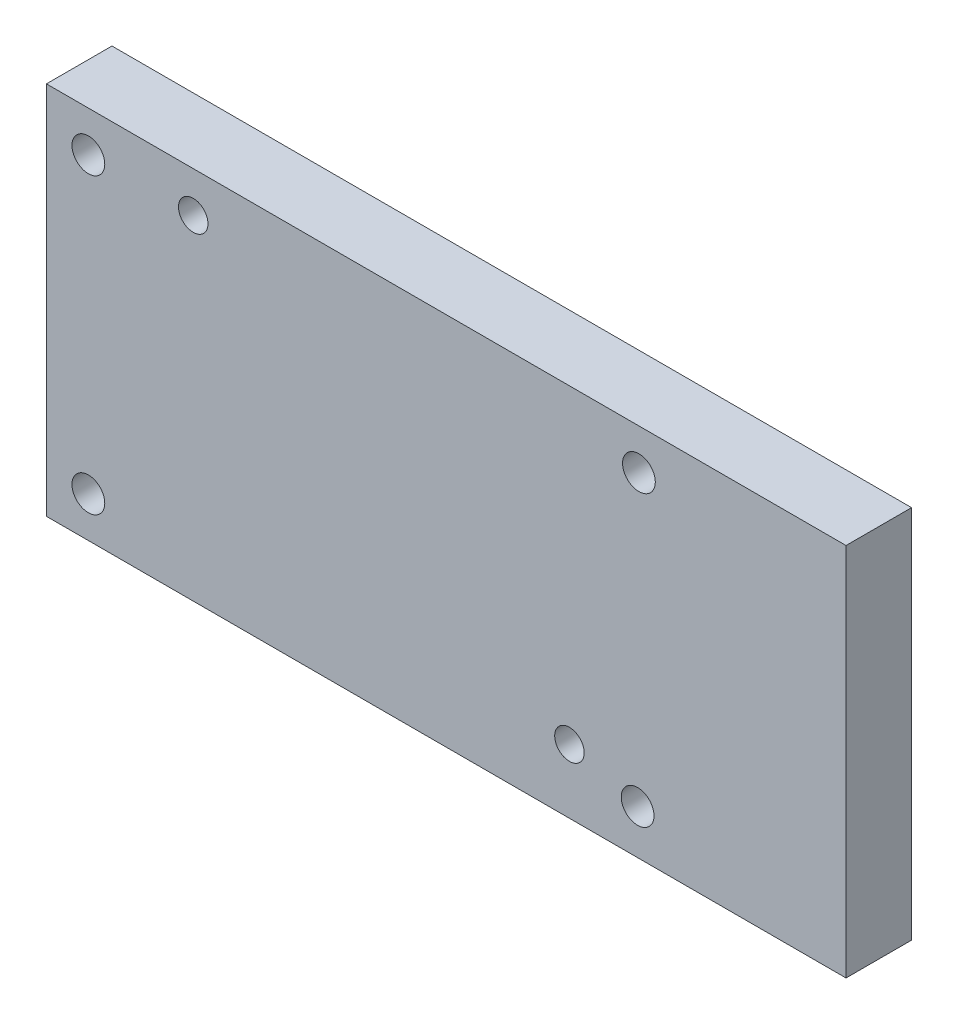
ISO-10303-21;
HEADER;
FILE_DESCRIPTION(('STEP AP214'),'2;1');
FILE_NAME('part.step','',(''),(''),'','','');
FILE_SCHEMA(('AUTOMOTIVE_DESIGN { 1 0 10303 214 1 1 1 1 }'));
ENDSEC;
DATA;
#1=APPLICATION_CONTEXT('core data for automotive mechanical design processes');
#2=APPLICATION_PROTOCOL_DEFINITION('international standard','automotive_design',2000,#1);
#3=PRODUCT_CONTEXT('',#1,'mechanical');
#4=PRODUCT('Part','Part','',(#3));
#5=PRODUCT_RELATED_PRODUCT_CATEGORY('part','',(#4));
#6=PRODUCT_DEFINITION_FORMATION('','',#4);
#7=PRODUCT_DEFINITION_CONTEXT('part definition',#1,'design');
#8=PRODUCT_DEFINITION('design','',#6,#7);
#9=PRODUCT_DEFINITION_SHAPE('','',#8);
#10=(LENGTH_UNIT() NAMED_UNIT(*) SI_UNIT(.MILLI.,.METRE.));
#11=(NAMED_UNIT(*) PLANE_ANGLE_UNIT() SI_UNIT($,.RADIAN.));
#12=(NAMED_UNIT(*) SI_UNIT($,.STERADIAN.) SOLID_ANGLE_UNIT());
#13=UNCERTAINTY_MEASURE_WITH_UNIT(LENGTH_MEASURE(1.E-05),#10,'distance_accuracy_value','');
#14=(GEOMETRIC_REPRESENTATION_CONTEXT(3) GLOBAL_UNCERTAINTY_ASSIGNED_CONTEXT((#13)) GLOBAL_UNIT_ASSIGNED_CONTEXT((#10,
#11,#12)) REPRESENTATION_CONTEXT('',''));
#15=CARTESIAN_POINT('',(0.,0.,0.));
#16=DIRECTION('',(0.,0.,1.));
#17=DIRECTION('',(1.,0.,0.));
#18=AXIS2_PLACEMENT_3D('',#15,#16,#17);
#19=CARTESIAN_POINT('',(0.,0.,5.));
#20=DIRECTION('',(0.,0.,1.));
#21=DIRECTION('',(1.,0.,0.));
#22=AXIS2_PLACEMENT_3D('',#19,#20,#21);
#23=PLANE('',#22);
#24=CARTESIAN_POINT('',(-49.8,25.4875,5.));
#25=DIRECTION('',(0.,0.,1.));
#26=DIRECTION('',(1.,0.,0.));
#27=AXIS2_PLACEMENT_3D('',#24,#25,#26);
#28=CIRCLE('',#27,1.125);
#29=CARTESIAN_POINT('',(-48.675,25.4875,5.));
#30=VERTEX_POINT('',#29);
#31=EDGE_CURVE('E132',#30,#30,#28,.T.);
#32=ORIENTED_EDGE('',*,*,#31,.F.);
#33=EDGE_LOOP('',(#32));
#34=FACE_BOUND('',#33,.T.);
#35=CARTESIAN_POINT('',(-15.8,25.4875,5.));
#36=DIRECTION('',(0.,0.,1.));
#37=DIRECTION('',(1.,0.,0.));
#38=AXIS2_PLACEMENT_3D('',#35,#36,#37);
#39=CIRCLE('',#38,1.25);
#40=CARTESIAN_POINT('',(-14.55,25.4875,5.));
#41=VERTEX_POINT('',#40);
#42=EDGE_CURVE('E120',#41,#41,#39,.T.);
#43=ORIENTED_EDGE('',*,*,#42,.F.);
#44=EDGE_LOOP('',(#43));
#45=FACE_BOUND('',#44,.T.);
#46=CARTESIAN_POINT('',(-57.8,3.08749999999999,5.));
#47=DIRECTION('',(0.,0.,1.));
#48=DIRECTION('',(1.,0.,0.));
#49=AXIS2_PLACEMENT_3D('',#46,#47,#48);
#50=CIRCLE('',#49,1.25);
#51=CARTESIAN_POINT('',(-56.55,3.08749999999999,5.));
#52=VERTEX_POINT('',#51);
#53=EDGE_CURVE('E99',#52,#52,#50,.T.);
#54=ORIENTED_EDGE('',*,*,#53,.F.);
#55=EDGE_LOOP('',(#54));
#56=FACE_BOUND('',#55,.T.);
#57=DIRECTION('',(0.,1.,0.));
#58=VECTOR('',#57,1.);
#59=CARTESIAN_POINT('',(0.,0.,5.));
#60=LINE('',#59,#58);
#61=CARTESIAN_POINT('',(0.,0.,5.));
#62=VERTEX_POINT('',#61);
#63=CARTESIAN_POINT('',(0.,28.575,5.));
#64=VERTEX_POINT('',#63);
#65=EDGE_CURVE('E84',#62,#64,#60,.T.);
#66=ORIENTED_EDGE('',*,*,#65,.T.);
#67=DIRECTION('',(-1.,0.,0.));
#68=VECTOR('',#67,1.);
#69=CARTESIAN_POINT('',(0.,28.575,5.));
#70=LINE('',#69,#68);
#71=CARTESIAN_POINT('',(-61.,28.575,5.));
#72=VERTEX_POINT('',#71);
#73=EDGE_CURVE('E79',#64,#72,#70,.T.);
#74=ORIENTED_EDGE('',*,*,#73,.T.);
#75=DIRECTION('',(0.,-1.,0.));
#76=VECTOR('',#75,1.);
#77=CARTESIAN_POINT('',(-61.,0.,5.));
#78=LINE('',#77,#76);
#79=CARTESIAN_POINT('',(-61.,0.,5.));
#80=VERTEX_POINT('',#79);
#81=EDGE_CURVE('E82',#72,#80,#78,.T.);
#82=ORIENTED_EDGE('',*,*,#81,.T.);
#83=DIRECTION('',(1.,0.,0.));
#84=VECTOR('',#83,1.);
#85=CARTESIAN_POINT('',(0.,0.,5.));
#86=LINE('',#85,#84);
#87=EDGE_CURVE('E49',#80,#62,#86,.T.);
#88=ORIENTED_EDGE('',*,*,#87,.T.);
#89=EDGE_LOOP('',(#66,#74,#82,#88));
#90=FACE_BOUND('',#89,.T.);
#91=CARTESIAN_POINT('',(-57.8,25.4875,5.));
#92=DIRECTION('',(0.,0.,1.));
#93=DIRECTION('',(1.,0.,0.));
#94=AXIS2_PLACEMENT_3D('',#91,#92,#93);
#95=CIRCLE('',#94,1.25);
#96=CARTESIAN_POINT('',(-56.55,25.4875,5.));
#97=VERTEX_POINT('',#96);
#98=EDGE_CURVE('E114',#97,#97,#95,.T.);
#99=ORIENTED_EDGE('',*,*,#98,.F.);
#100=EDGE_LOOP('',(#99));
#101=FACE_BOUND('',#100,.T.);
#102=CARTESIAN_POINT('',(-15.9,3.38749999999999,5.));
#103=DIRECTION('',(0.,0.,1.));
#104=DIRECTION('',(1.,0.,0.));
#105=AXIS2_PLACEMENT_3D('',#102,#103,#104);
#106=CIRCLE('',#105,1.25);
#107=CARTESIAN_POINT('',(-14.65,3.38749999999999,5.));
#108=VERTEX_POINT('',#107);
#109=EDGE_CURVE('E126',#108,#108,#106,.T.);
#110=ORIENTED_EDGE('',*,*,#109,.F.);
#111=EDGE_LOOP('',(#110));
#112=FACE_BOUND('',#111,.T.);
#113=CARTESIAN_POINT('',(-21.1,4.88749999999999,5.));
#114=DIRECTION('',(0.,0.,1.));
#115=DIRECTION('',(1.,0.,0.));
#116=AXIS2_PLACEMENT_3D('',#113,#114,#115);
#117=CIRCLE('',#116,1.125);
#118=CARTESIAN_POINT('',(-19.975,4.88749999999999,5.));
#119=VERTEX_POINT('',#118);
#120=EDGE_CURVE('E138',#119,#119,#117,.T.);
#121=ORIENTED_EDGE('',*,*,#120,.F.);
#122=EDGE_LOOP('',(#121));
#123=FACE_BOUND('',#122,.T.);
#124=ADVANCED_FACE('F32',(#34,#45,#56,#90,#101,#112,#123),#23,.T.);
#125=CARTESIAN_POINT('',(0.,0.,0.));
#126=DIRECTION('',(0.,0.,1.));
#127=DIRECTION('',(1.,0.,0.));
#128=AXIS2_PLACEMENT_3D('',#125,#126,#127);
#129=PLANE('',#128);
#130=CARTESIAN_POINT('',(-49.8,25.4875,0.));
#131=DIRECTION('',(0.,0.,1.));
#132=DIRECTION('',(1.,0.,0.));
#133=AXIS2_PLACEMENT_3D('',#130,#131,#132);
#134=CIRCLE('',#133,1.125);
#135=CARTESIAN_POINT('',(-48.675,25.4875,0.));
#136=VERTEX_POINT('',#135);
#137=EDGE_CURVE('E135',#136,#136,#134,.T.);
#138=ORIENTED_EDGE('',*,*,#137,.T.);
#139=EDGE_LOOP('',(#138));
#140=FACE_BOUND('',#139,.T.);
#141=CARTESIAN_POINT('',(-15.8,25.4875,0.));
#142=DIRECTION('',(0.,0.,1.));
#143=DIRECTION('',(1.,0.,0.));
#144=AXIS2_PLACEMENT_3D('',#141,#142,#143);
#145=CIRCLE('',#144,1.25);
#146=CARTESIAN_POINT('',(-14.55,25.4875,0.));
#147=VERTEX_POINT('',#146);
#148=EDGE_CURVE('E123',#147,#147,#145,.T.);
#149=ORIENTED_EDGE('',*,*,#148,.T.);
#150=EDGE_LOOP('',(#149));
#151=FACE_BOUND('',#150,.T.);
#152=CARTESIAN_POINT('',(-57.8,3.08749999999999,0.));
#153=DIRECTION('',(0.,0.,1.));
#154=DIRECTION('',(1.,0.,0.));
#155=AXIS2_PLACEMENT_3D('',#152,#153,#154);
#156=CIRCLE('',#155,1.25);
#157=CARTESIAN_POINT('',(-56.55,3.08749999999999,0.));
#158=VERTEX_POINT('',#157);
#159=EDGE_CURVE('E111',#158,#158,#156,.T.);
#160=ORIENTED_EDGE('',*,*,#159,.T.);
#161=EDGE_LOOP('',(#160));
#162=FACE_BOUND('',#161,.T.);
#163=DIRECTION('',(0.,1.,0.));
#164=VECTOR('',#163,1.);
#165=CARTESIAN_POINT('',(0.,0.,0.));
#166=LINE('',#165,#164);
#167=CARTESIAN_POINT('',(0.,0.,0.));
#168=VERTEX_POINT('',#167);
#169=CARTESIAN_POINT('',(0.,28.575,0.));
#170=VERTEX_POINT('',#169);
#171=EDGE_CURVE('E96',#168,#170,#166,.T.);
#172=ORIENTED_EDGE('',*,*,#171,.F.);
#173=DIRECTION('',(1.,0.,0.));
#174=VECTOR('',#173,1.);
#175=CARTESIAN_POINT('',(0.,0.,0.));
#176=LINE('',#175,#174);
#177=CARTESIAN_POINT('',(-61.,0.,0.));
#178=VERTEX_POINT('',#177);
#179=EDGE_CURVE('E72',#178,#168,#176,.T.);
#180=ORIENTED_EDGE('',*,*,#179,.F.);
#181=DIRECTION('',(0.,-1.,0.));
#182=VECTOR('',#181,1.);
#183=CARTESIAN_POINT('',(-61.,0.,0.));
#184=LINE('',#183,#182);
#185=CARTESIAN_POINT('',(-61.,28.575,0.));
#186=VERTEX_POINT('',#185);
#187=EDGE_CURVE('E66',#186,#178,#184,.T.);
#188=ORIENTED_EDGE('',*,*,#187,.F.);
#189=DIRECTION('',(-1.,0.,0.));
#190=VECTOR('',#189,1.);
#191=CARTESIAN_POINT('',(0.,28.575,0.));
#192=LINE('',#191,#190);
#193=EDGE_CURVE('E88',#170,#186,#192,.T.);
#194=ORIENTED_EDGE('',*,*,#193,.F.);
#195=EDGE_LOOP('',(#172,#180,#188,#194));
#196=FACE_BOUND('',#195,.T.);
#197=CARTESIAN_POINT('',(-57.8,25.4875,0.));
#198=DIRECTION('',(0.,0.,1.));
#199=DIRECTION('',(1.,0.,0.));
#200=AXIS2_PLACEMENT_3D('',#197,#198,#199);
#201=CIRCLE('',#200,1.25);
#202=CARTESIAN_POINT('',(-56.55,25.4875,0.));
#203=VERTEX_POINT('',#202);
#204=EDGE_CURVE('E117',#203,#203,#201,.T.);
#205=ORIENTED_EDGE('',*,*,#204,.T.);
#206=EDGE_LOOP('',(#205));
#207=FACE_BOUND('',#206,.T.);
#208=CARTESIAN_POINT('',(-15.9,3.38749999999999,0.));
#209=DIRECTION('',(0.,0.,1.));
#210=DIRECTION('',(1.,0.,0.));
#211=AXIS2_PLACEMENT_3D('',#208,#209,#210);
#212=CIRCLE('',#211,1.25);
#213=CARTESIAN_POINT('',(-14.65,3.38749999999999,0.));
#214=VERTEX_POINT('',#213);
#215=EDGE_CURVE('E129',#214,#214,#212,.T.);
#216=ORIENTED_EDGE('',*,*,#215,.T.);
#217=EDGE_LOOP('',(#216));
#218=FACE_BOUND('',#217,.T.);
#219=CARTESIAN_POINT('',(-21.1,4.88749999999999,0.));
#220=DIRECTION('',(0.,0.,1.));
#221=DIRECTION('',(1.,0.,0.));
#222=AXIS2_PLACEMENT_3D('',#219,#220,#221);
#223=CIRCLE('',#222,1.125);
#224=CARTESIAN_POINT('',(-19.975,4.88749999999999,0.));
#225=VERTEX_POINT('',#224);
#226=EDGE_CURVE('E141',#225,#225,#223,.T.);
#227=ORIENTED_EDGE('',*,*,#226,.T.);
#228=EDGE_LOOP('',(#227));
#229=FACE_BOUND('',#228,.T.);
#230=ADVANCED_FACE('F107',(#140,#151,#162,#196,#207,#218,#229),#129,.F.);
#231=CARTESIAN_POINT('',(0.,0.,5.));
#232=DIRECTION('',(-1.,0.,0.));
#233=DIRECTION('',(0.,0.,1.));
#234=AXIS2_PLACEMENT_3D('',#231,#232,#233);
#235=PLANE('',#234);
#236=ORIENTED_EDGE('',*,*,#171,.T.);
#237=DIRECTION('',(0.,0.,-1.));
#238=VECTOR('',#237,1.);
#239=CARTESIAN_POINT('',(0.,28.575,5.));
#240=LINE('',#239,#238);
#241=EDGE_CURVE('E11',#64,#170,#240,.T.);
#242=ORIENTED_EDGE('',*,*,#241,.F.);
#243=ORIENTED_EDGE('',*,*,#65,.F.);
#244=DIRECTION('',(0.,0.,-1.));
#245=VECTOR('',#244,1.);
#246=CARTESIAN_POINT('',(0.,0.,5.));
#247=LINE('',#246,#245);
#248=EDGE_CURVE('E92',#62,#168,#247,.T.);
#249=ORIENTED_EDGE('',*,*,#248,.T.);
#250=EDGE_LOOP('',(#236,#242,#243,#249));
#251=FACE_BOUND('',#250,.T.);
#252=ADVANCED_FACE('F34',(#251),#235,.F.);
#253=CARTESIAN_POINT('',(0.,28.575,5.));
#254=DIRECTION('',(0.,-1.,0.));
#255=DIRECTION('',(1.,0.,0.));
#256=AXIS2_PLACEMENT_3D('',#253,#254,#255);
#257=PLANE('',#256);
#258=ORIENTED_EDGE('',*,*,#193,.T.);
#259=DIRECTION('',(0.,0.,-1.));
#260=VECTOR('',#259,1.);
#261=CARTESIAN_POINT('',(-61.,28.575,5.));
#262=LINE('',#261,#260);
#263=EDGE_CURVE('E41',#72,#186,#262,.T.);
#264=ORIENTED_EDGE('',*,*,#263,.F.);
#265=ORIENTED_EDGE('',*,*,#73,.F.);
#266=ORIENTED_EDGE('',*,*,#241,.T.);
#267=EDGE_LOOP('',(#258,#264,#265,#266));
#268=FACE_BOUND('',#267,.T.);
#269=ADVANCED_FACE('F87',(#268),#257,.F.);
#270=CARTESIAN_POINT('',(-61.,0.,5.));
#271=DIRECTION('',(1.,0.,0.));
#272=DIRECTION('',(0.,0.,-1.));
#273=AXIS2_PLACEMENT_3D('',#270,#271,#272);
#274=PLANE('',#273);
#275=ORIENTED_EDGE('',*,*,#187,.T.);
#276=DIRECTION('',(0.,0.,-1.));
#277=VECTOR('',#276,1.);
#278=CARTESIAN_POINT('',(-61.,0.,5.));
#279=LINE('',#278,#277);
#280=EDGE_CURVE('E89',#80,#178,#279,.T.);
#281=ORIENTED_EDGE('',*,*,#280,.F.);
#282=ORIENTED_EDGE('',*,*,#81,.F.);
#283=ORIENTED_EDGE('',*,*,#263,.T.);
#284=EDGE_LOOP('',(#275,#281,#282,#283));
#285=FACE_BOUND('',#284,.T.);
#286=ADVANCED_FACE('F90',(#285),#274,.F.);
#287=CARTESIAN_POINT('',(0.,0.,5.));
#288=DIRECTION('',(0.,1.,0.));
#289=DIRECTION('',(-1.,0.,0.));
#290=AXIS2_PLACEMENT_3D('',#287,#288,#289);
#291=PLANE('',#290);
#292=ORIENTED_EDGE('',*,*,#179,.T.);
#293=ORIENTED_EDGE('',*,*,#248,.F.);
#294=ORIENTED_EDGE('',*,*,#87,.F.);
#295=ORIENTED_EDGE('',*,*,#280,.T.);
#296=EDGE_LOOP('',(#292,#293,#294,#295));
#297=FACE_BOUND('',#296,.T.);
#298=ADVANCED_FACE('F104',(#297),#291,.F.);
#299=CARTESIAN_POINT('',(-57.8,3.08749999999999,5.));
#300=DIRECTION('',(0.,0.,-1.));
#301=DIRECTION('',(-1.,0.,0.));
#302=AXIS2_PLACEMENT_3D('',#299,#300,#301);
#303=CYLINDRICAL_SURFACE('',#302,1.25);
#304=ORIENTED_EDGE('',*,*,#53,.T.);
#305=EDGE_LOOP('',(#304));
#306=FACE_BOUND('',#305,.T.);
#307=ORIENTED_EDGE('',*,*,#159,.F.);
#308=EDGE_LOOP('',(#307));
#309=FACE_BOUND('',#308,.T.);
#310=ADVANCED_FACE('F161',(#306,#309),#303,.F.);
#311=CARTESIAN_POINT('',(-57.8,25.4875,5.));
#312=DIRECTION('',(0.,0.,-1.));
#313=DIRECTION('',(-1.,0.,0.));
#314=AXIS2_PLACEMENT_3D('',#311,#312,#313);
#315=CYLINDRICAL_SURFACE('',#314,1.25);
#316=ORIENTED_EDGE('',*,*,#98,.T.);
#317=EDGE_LOOP('',(#316));
#318=FACE_BOUND('',#317,.T.);
#319=ORIENTED_EDGE('',*,*,#204,.F.);
#320=EDGE_LOOP('',(#319));
#321=FACE_BOUND('',#320,.T.);
#322=ADVANCED_FACE('F207',(#318,#321),#315,.F.);
#323=CARTESIAN_POINT('',(-15.8,25.4875,5.));
#324=DIRECTION('',(0.,0.,-1.));
#325=DIRECTION('',(-1.,0.,0.));
#326=AXIS2_PLACEMENT_3D('',#323,#324,#325);
#327=CYLINDRICAL_SURFACE('',#326,1.25);
#328=ORIENTED_EDGE('',*,*,#42,.T.);
#329=EDGE_LOOP('',(#328));
#330=FACE_BOUND('',#329,.T.);
#331=ORIENTED_EDGE('',*,*,#148,.F.);
#332=EDGE_LOOP('',(#331));
#333=FACE_BOUND('',#332,.T.);
#334=ADVANCED_FACE('F215',(#330,#333),#327,.F.);
#335=CARTESIAN_POINT('',(-15.9,3.38749999999999,5.));
#336=DIRECTION('',(0.,0.,-1.));
#337=DIRECTION('',(-1.,0.,0.));
#338=AXIS2_PLACEMENT_3D('',#335,#336,#337);
#339=CYLINDRICAL_SURFACE('',#338,1.25);
#340=ORIENTED_EDGE('',*,*,#109,.T.);
#341=EDGE_LOOP('',(#340));
#342=FACE_BOUND('',#341,.T.);
#343=ORIENTED_EDGE('',*,*,#215,.F.);
#344=EDGE_LOOP('',(#343));
#345=FACE_BOUND('',#344,.T.);
#346=ADVANCED_FACE('F223',(#342,#345),#339,.F.);
#347=CARTESIAN_POINT('',(-49.8,25.4875,5.));
#348=DIRECTION('',(0.,0.,-1.));
#349=DIRECTION('',(-1.,0.,0.));
#350=AXIS2_PLACEMENT_3D('',#347,#348,#349);
#351=CYLINDRICAL_SURFACE('',#350,1.125);
#352=ORIENTED_EDGE('',*,*,#31,.T.);
#353=EDGE_LOOP('',(#352));
#354=FACE_BOUND('',#353,.T.);
#355=ORIENTED_EDGE('',*,*,#137,.F.);
#356=EDGE_LOOP('',(#355));
#357=FACE_BOUND('',#356,.T.);
#358=ADVANCED_FACE('F232',(#354,#357),#351,.F.);
#359=CARTESIAN_POINT('',(-21.1,4.88749999999999,5.));
#360=DIRECTION('',(0.,0.,-1.));
#361=DIRECTION('',(-1.,0.,0.));
#362=AXIS2_PLACEMENT_3D('',#359,#360,#361);
#363=CYLINDRICAL_SURFACE('',#362,1.125);
#364=ORIENTED_EDGE('',*,*,#120,.T.);
#365=EDGE_LOOP('',(#364));
#366=FACE_BOUND('',#365,.T.);
#367=ORIENTED_EDGE('',*,*,#226,.F.);
#368=EDGE_LOOP('',(#367));
#369=FACE_BOUND('',#368,.T.);
#370=ADVANCED_FACE('F147',(#366,#369),#363,.F.);
#371=CLOSED_SHELL('',(#124,#230,#252,#269,#286,#298,#310,#322,#334,#346,#358,#370));
#372=MANIFOLD_SOLID_BREP('B2',#371);
#373=ADVANCED_BREP_SHAPE_REPRESENTATION('',(#18,#372),#14);
#374=SHAPE_DEFINITION_REPRESENTATION(#9,#373);
ENDSEC;
END-ISO-10303-21;
